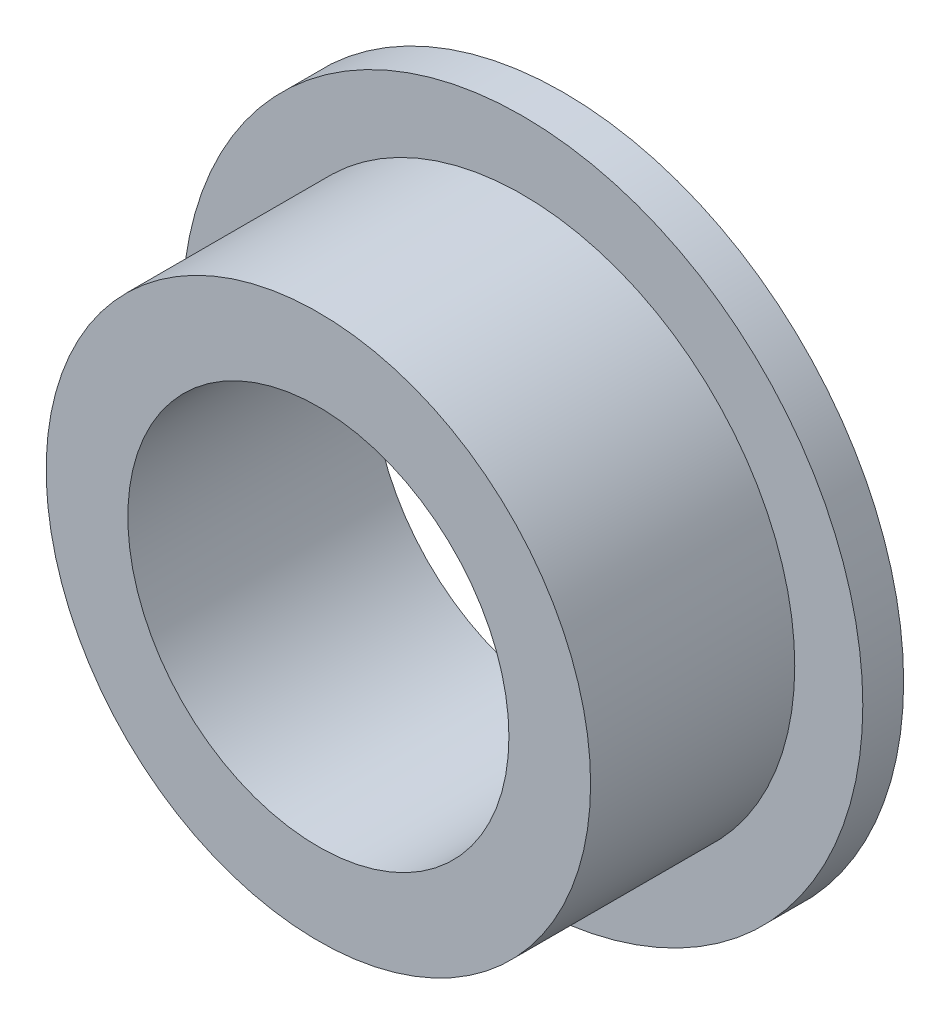
ISO-10303-21;
HEADER;
FILE_DESCRIPTION(('STEP AP214'),'2;1');
FILE_NAME('part.step','',(''),(''),'','','');
FILE_SCHEMA(('AUTOMOTIVE_DESIGN { 1 0 10303 214 1 1 1 1 }'));
ENDSEC;
DATA;
#1=APPLICATION_CONTEXT('core data for automotive mechanical design processes');
#2=APPLICATION_PROTOCOL_DEFINITION('international standard','automotive_design',2000,#1);
#3=PRODUCT_CONTEXT('',#1,'mechanical');
#4=PRODUCT('Part','Part','',(#3));
#5=PRODUCT_RELATED_PRODUCT_CATEGORY('part','',(#4));
#6=PRODUCT_DEFINITION_FORMATION('','',#4);
#7=PRODUCT_DEFINITION_CONTEXT('part definition',#1,'design');
#8=PRODUCT_DEFINITION('design','',#6,#7);
#9=PRODUCT_DEFINITION_SHAPE('','',#8);
#10=(LENGTH_UNIT() NAMED_UNIT(*) SI_UNIT(.MILLI.,.METRE.));
#11=(NAMED_UNIT(*) PLANE_ANGLE_UNIT() SI_UNIT($,.RADIAN.));
#12=(NAMED_UNIT(*) SI_UNIT($,.STERADIAN.) SOLID_ANGLE_UNIT());
#13=UNCERTAINTY_MEASURE_WITH_UNIT(LENGTH_MEASURE(1.E-05),#10,'distance_accuracy_value','');
#14=(GEOMETRIC_REPRESENTATION_CONTEXT(3) GLOBAL_UNCERTAINTY_ASSIGNED_CONTEXT((#13)) GLOBAL_UNIT_ASSIGNED_CONTEXT((#10,
#11,#12)) REPRESENTATION_CONTEXT('',''));
#15=CARTESIAN_POINT('',(0.,0.,0.));
#16=DIRECTION('',(0.,0.,1.));
#17=DIRECTION('',(1.,0.,0.));
#18=AXIS2_PLACEMENT_3D('',#15,#16,#17);
#19=CARTESIAN_POINT('',(0.,0.,0.3));
#20=DIRECTION('',(0.,0.,1.));
#21=DIRECTION('',(1.,0.,0.));
#22=AXIS2_PLACEMENT_3D('',#19,#20,#21);
#23=PLANE('',#22);
#24=CARTESIAN_POINT('',(0.,0.,0.3));
#25=DIRECTION('',(0.,0.,1.));
#26=DIRECTION('',(1.,0.,0.));
#27=AXIS2_PLACEMENT_3D('',#24,#25,#26);
#28=CIRCLE('',#27,2.5);
#29=CARTESIAN_POINT('',(2.5,0.,0.3));
#30=VERTEX_POINT('',#29);
#31=EDGE_CURVE('E10',#30,#30,#28,.T.);
#32=ORIENTED_EDGE('',*,*,#31,.T.);
#33=EDGE_LOOP('',(#32));
#34=FACE_BOUND('',#33,.T.);
#35=CARTESIAN_POINT('',(0.,0.,0.3));
#36=DIRECTION('',(0.,0.,1.));
#37=DIRECTION('',(1.,0.,0.));
#38=AXIS2_PLACEMENT_3D('',#35,#36,#37);
#39=CIRCLE('',#38,2.);
#40=CARTESIAN_POINT('',(2.,0.,0.3));
#41=VERTEX_POINT('',#40);
#42=EDGE_CURVE('E56',#41,#41,#39,.T.);
#43=ORIENTED_EDGE('',*,*,#42,.F.);
#44=EDGE_LOOP('',(#43));
#45=FACE_BOUND('',#44,.T.);
#46=ADVANCED_FACE('F37',(#34,#45),#23,.T.);
#47=CARTESIAN_POINT('',(0.,0.,0.));
#48=DIRECTION('',(0.,0.,1.));
#49=DIRECTION('',(1.,0.,0.));
#50=AXIS2_PLACEMENT_3D('',#47,#48,#49);
#51=PLANE('',#50);
#52=CARTESIAN_POINT('',(0.,0.,0.));
#53=DIRECTION('',(0.,0.,1.));
#54=DIRECTION('',(1.,0.,0.));
#55=AXIS2_PLACEMENT_3D('',#52,#53,#54);
#56=CIRCLE('',#55,2.5);
#57=CARTESIAN_POINT('',(2.5,0.,0.));
#58=VERTEX_POINT('',#57);
#59=EDGE_CURVE('E41',#58,#58,#56,.T.);
#60=ORIENTED_EDGE('',*,*,#59,.F.);
#61=EDGE_LOOP('',(#60));
#62=FACE_BOUND('',#61,.T.);
#63=CARTESIAN_POINT('',(0.,0.,0.));
#64=DIRECTION('',(0.,0.,1.));
#65=DIRECTION('',(1.,0.,0.));
#66=AXIS2_PLACEMENT_3D('',#63,#64,#65);
#67=CIRCLE('',#66,1.4);
#68=CARTESIAN_POINT('',(1.4,0.,0.));
#69=VERTEX_POINT('',#68);
#70=EDGE_CURVE('E50',#69,#69,#67,.T.);
#71=ORIENTED_EDGE('',*,*,#70,.T.);
#72=EDGE_LOOP('',(#71));
#73=FACE_BOUND('',#72,.T.);
#74=ADVANCED_FACE('F84',(#62,#73),#51,.F.);
#75=CARTESIAN_POINT('',(0.,0.,0.3));
#76=DIRECTION('',(0.,0.,-1.));
#77=DIRECTION('',(-1.,0.,0.));
#78=AXIS2_PLACEMENT_3D('',#75,#76,#77);
#79=CYLINDRICAL_SURFACE('',#78,2.5);
#80=ORIENTED_EDGE('',*,*,#31,.F.);
#81=EDGE_LOOP('',(#80));
#82=FACE_BOUND('',#81,.T.);
#83=ORIENTED_EDGE('',*,*,#59,.T.);
#84=EDGE_LOOP('',(#83));
#85=FACE_BOUND('',#84,.T.);
#86=ADVANCED_FACE('F39',(#82,#85),#79,.T.);
#87=CARTESIAN_POINT('',(0.,0.,0.3));
#88=DIRECTION('',(0.,0.,-1.));
#89=DIRECTION('',(-1.,0.,0.));
#90=AXIS2_PLACEMENT_3D('',#87,#88,#89);
#91=CYLINDRICAL_SURFACE('',#90,1.4);
#92=ORIENTED_EDGE('',*,*,#70,.F.);
#93=EDGE_LOOP('',(#92));
#94=FACE_BOUND('',#93,.T.);
#95=CARTESIAN_POINT('',(0.,0.,1.8));
#96=DIRECTION('',(0.,0.,1.));
#97=DIRECTION('',(1.,0.,0.));
#98=AXIS2_PLACEMENT_3D('',#95,#96,#97);
#99=CIRCLE('',#98,1.4);
#100=CARTESIAN_POINT('',(1.4,0.,1.8));
#101=VERTEX_POINT('',#100);
#102=EDGE_CURVE('E60',#101,#101,#99,.T.);
#103=ORIENTED_EDGE('',*,*,#102,.T.);
#104=EDGE_LOOP('',(#103));
#105=FACE_BOUND('',#104,.T.);
#106=ADVANCED_FACE('F68',(#94,#105),#91,.F.);
#107=CARTESIAN_POINT('',(0.,0.,1.8));
#108=DIRECTION('',(0.,0.,1.));
#109=DIRECTION('',(1.,0.,0.));
#110=AXIS2_PLACEMENT_3D('',#107,#108,#109);
#111=PLANE('',#110);
#112=CARTESIAN_POINT('',(0.,0.,1.8));
#113=DIRECTION('',(0.,0.,1.));
#114=DIRECTION('',(1.,0.,0.));
#115=AXIS2_PLACEMENT_3D('',#112,#113,#114);
#116=CIRCLE('',#115,2.);
#117=CARTESIAN_POINT('',(2.,0.,1.8));
#118=VERTEX_POINT('',#117);
#119=EDGE_CURVE('E55',#118,#118,#116,.T.);
#120=ORIENTED_EDGE('',*,*,#119,.T.);
#121=EDGE_LOOP('',(#120));
#122=FACE_BOUND('',#121,.T.);
#123=ORIENTED_EDGE('',*,*,#102,.F.);
#124=EDGE_LOOP('',(#123));
#125=FACE_BOUND('',#124,.T.);
#126=ADVANCED_FACE('F70',(#122,#125),#111,.T.);
#127=CARTESIAN_POINT('',(0.,0.,1.8));
#128=DIRECTION('',(0.,0.,-1.));
#129=DIRECTION('',(-1.,0.,0.));
#130=AXIS2_PLACEMENT_3D('',#127,#128,#129);
#131=CYLINDRICAL_SURFACE('',#130,2.);
#132=ORIENTED_EDGE('',*,*,#119,.F.);
#133=EDGE_LOOP('',(#132));
#134=FACE_BOUND('',#133,.T.);
#135=ORIENTED_EDGE('',*,*,#42,.T.);
#136=EDGE_LOOP('',(#135));
#137=FACE_BOUND('',#136,.T.);
#138=ADVANCED_FACE('F72',(#134,#137),#131,.T.);
#139=CLOSED_SHELL('',(#46,#74,#86,#106,#126,#138));
#140=MANIFOLD_SOLID_BREP('B2',#139);
#141=ADVANCED_BREP_SHAPE_REPRESENTATION('',(#18,#140),#14);
#142=SHAPE_DEFINITION_REPRESENTATION(#9,#141);
ENDSEC;
END-ISO-10303-21;
